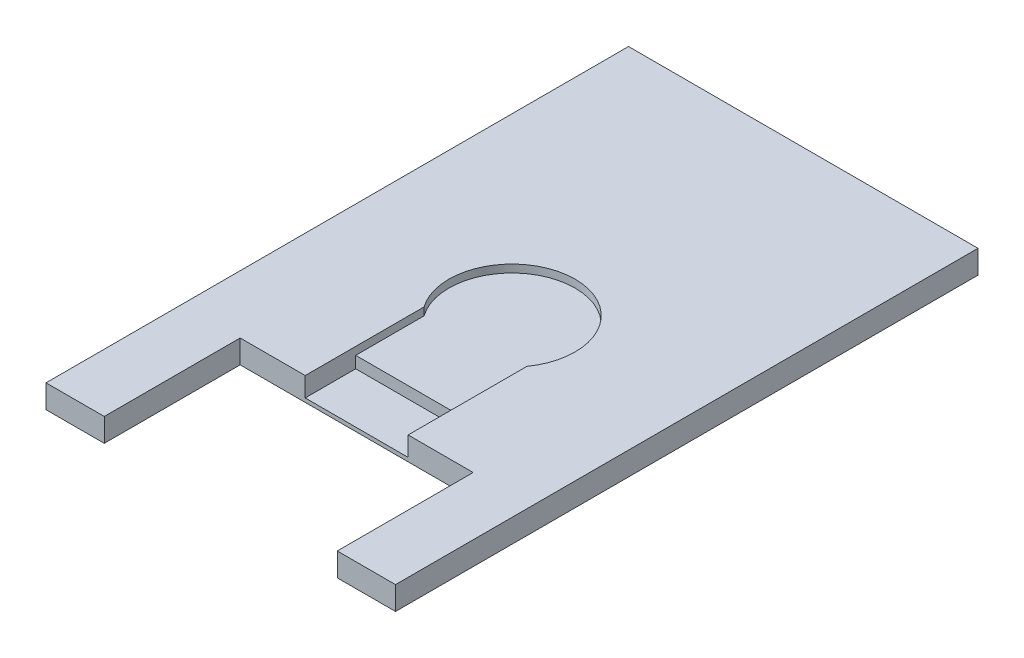
ISO-10303-21;
HEADER;
FILE_DESCRIPTION(('STEP AP214'),'2;1');
FILE_NAME('part.step','',(''),(''),'','','');
FILE_SCHEMA(('AUTOMOTIVE_DESIGN { 1 0 10303 214 1 1 1 1 }'));
ENDSEC;
DATA;
#1=APPLICATION_CONTEXT('core data for automotive mechanical design processes');
#2=APPLICATION_PROTOCOL_DEFINITION('international standard','automotive_design',2000,#1);
#3=PRODUCT_CONTEXT('',#1,'mechanical');
#4=PRODUCT('Part','Part','',(#3));
#5=PRODUCT_RELATED_PRODUCT_CATEGORY('part','',(#4));
#6=PRODUCT_DEFINITION_FORMATION('','',#4);
#7=PRODUCT_DEFINITION_CONTEXT('part definition',#1,'design');
#8=PRODUCT_DEFINITION('design','',#6,#7);
#9=PRODUCT_DEFINITION_SHAPE('','',#8);
#10=(LENGTH_UNIT() NAMED_UNIT(*) SI_UNIT(.MILLI.,.METRE.));
#11=(NAMED_UNIT(*) PLANE_ANGLE_UNIT() SI_UNIT($,.RADIAN.));
#12=(NAMED_UNIT(*) SI_UNIT($,.STERADIAN.) SOLID_ANGLE_UNIT());
#13=UNCERTAINTY_MEASURE_WITH_UNIT(LENGTH_MEASURE(1.E-05),#10,'distance_accuracy_value','');
#14=(GEOMETRIC_REPRESENTATION_CONTEXT(3) GLOBAL_UNCERTAINTY_ASSIGNED_CONTEXT((#13)) GLOBAL_UNIT_ASSIGNED_CONTEXT((#10,
#11,#12)) REPRESENTATION_CONTEXT('',''));
#15=CARTESIAN_POINT('',(0.,0.,0.));
#16=DIRECTION('',(0.,0.,1.));
#17=DIRECTION('',(1.,0.,0.));
#18=AXIS2_PLACEMENT_3D('',#15,#16,#17);
#19=CARTESIAN_POINT('',(-5.08735195444298,1.524,28.5140513925074));
#20=DIRECTION('',(0.,0.,-1.));
#21=DIRECTION('',(-1.,0.,0.));
#22=AXIS2_PLACEMENT_3D('',#19,#20,#21);
#23=PLANE('',#22);
#24=DIRECTION('',(0.,1.,0.));
#25=VECTOR('',#24,1.);
#26=CARTESIAN_POINT('',(13.962648045557,-2.032,28.5140513925057));
#27=LINE('',#26,#25);
#28=CARTESIAN_POINT('',(13.962648045557,0.,28.5140513925057));
#29=VERTEX_POINT('',#28);
#30=CARTESIAN_POINT('',(13.962648045557,1.524,28.5140513925057));
#31=VERTEX_POINT('',#30);
#32=EDGE_CURVE('E246',#29,#31,#27,.T.);
#33=ORIENTED_EDGE('',*,*,#32,.F.);
#34=DIRECTION('',(1.,0.,0.));
#35=VECTOR('',#34,1.);
#36=CARTESIAN_POINT('',(-5.08735195444298,0.,28.5140513925074));
#37=LINE('',#36,#35);
#38=CARTESIAN_POINT('',(17.772648045557,0.,28.5140513925074));
#39=VERTEX_POINT('',#38);
#40=EDGE_CURVE('E397',#29,#39,#37,.T.);
#41=ORIENTED_EDGE('',*,*,#40,.T.);
#42=DIRECTION('',(0.,-1.,0.));
#43=VECTOR('',#42,1.);
#44=CARTESIAN_POINT('',(17.772648045557,1.524,28.5140513925074));
#45=LINE('',#44,#43);
#46=CARTESIAN_POINT('',(17.772648045557,1.524,28.5140513925074));
#47=VERTEX_POINT('',#46);
#48=EDGE_CURVE('E414',#47,#39,#45,.T.);
#49=ORIENTED_EDGE('',*,*,#48,.F.);
#50=DIRECTION('',(1.,0.,0.));
#51=VECTOR('',#50,1.);
#52=CARTESIAN_POINT('',(-5.08735195444298,1.524,28.5140513925074));
#53=LINE('',#52,#51);
#54=EDGE_CURVE('E381',#31,#47,#53,.T.);
#55=ORIENTED_EDGE('',*,*,#54,.F.);
#56=EDGE_LOOP('',(#33,#41,#49,#55));
#57=FACE_BOUND('',#56,.T.);
#58=ADVANCED_FACE('F43',(#57),#23,.F.);
#59=CARTESIAN_POINT('',(-5.08735195444298,0.,28.5140513925074));
#60=VERTEX_POINT('',#59);
#61=CARTESIAN_POINT('',(-1.27735195444298,0.,28.5140513925057));
#62=VERTEX_POINT('',#61);
#63=EDGE_CURVE('E398',#60,#62,#37,.T.);
#64=ORIENTED_EDGE('',*,*,#63,.T.);
#65=DIRECTION('',(0.,1.,0.));
#66=VECTOR('',#65,1.);
#67=CARTESIAN_POINT('',(-1.27735195444298,-2.032,28.5140513925057));
#68=LINE('',#67,#66);
#69=CARTESIAN_POINT('',(-1.27735195444298,1.524,28.5140513925057));
#70=VERTEX_POINT('',#69);
#71=EDGE_CURVE('E255',#62,#70,#68,.T.);
#72=ORIENTED_EDGE('',*,*,#71,.T.);
#73=CARTESIAN_POINT('',(-5.08735195444298,1.524,28.5140513925074));
#74=VERTEX_POINT('',#73);
#75=EDGE_CURVE('E383',#74,#70,#53,.T.);
#76=ORIENTED_EDGE('',*,*,#75,.F.);
#77=DIRECTION('',(0.,-1.,0.));
#78=VECTOR('',#77,1.);
#79=CARTESIAN_POINT('',(-5.08735195444298,1.524,28.5140513925074));
#80=LINE('',#79,#78);
#81=EDGE_CURVE('E418',#74,#60,#80,.T.);
#82=ORIENTED_EDGE('',*,*,#81,.T.);
#83=EDGE_LOOP('',(#64,#72,#76,#82));
#84=FACE_BOUND('',#83,.T.);
#85=ADVANCED_FACE('F449',(#84),#23,.F.);
#86=CARTESIAN_POINT('',(0.,1.524,0.));
#87=DIRECTION('',(0.,1.,0.));
#88=DIRECTION('',(0.,0.,1.));
#89=AXIS2_PLACEMENT_3D('',#86,#87,#88);
#90=PLANE('',#89);
#91=DIRECTION('',(0.,0.,1.));
#92=VECTOR('',#91,1.);
#93=CARTESIAN_POINT('',(-1.27735195444298,1.524,0.));
#94=LINE('',#93,#92);
#95=CARTESIAN_POINT('',(-1.27735195444298,1.524,19.6240513925057));
#96=VERTEX_POINT('',#95);
#97=EDGE_CURVE('E234',#96,#70,#94,.T.);
#98=ORIENTED_EDGE('',*,*,#97,.F.);
#99=DIRECTION('',(-1.,0.,0.));
#100=VECTOR('',#99,1.);
#101=CARTESIAN_POINT('',(0.,1.524,19.6240513925057));
#102=LINE('',#101,#100);
#103=CARTESIAN_POINT('',(2.97714804554619,1.524,19.6240513925057));
#104=VERTEX_POINT('',#103);
#105=EDGE_CURVE('E239',#104,#96,#102,.T.);
#106=ORIENTED_EDGE('',*,*,#105,.F.);
#107=DIRECTION('',(0.,0.,1.));
#108=VECTOR('',#107,1.);
#109=CARTESIAN_POINT('',(2.97714804554618,1.524,0.));
#110=LINE('',#109,#108);
#111=CARTESIAN_POINT('',(2.97714804554618,1.524,11.8535421332451));
#112=VERTEX_POINT('',#111);
#113=EDGE_CURVE('E279',#112,#104,#110,.T.);
#114=ORIENTED_EDGE('',*,*,#113,.F.);
#115=CARTESIAN_POINT('',(6.34264804554618,1.524,9.46405139250738));
#116=DIRECTION('',(0.,1.,0.));
#117=DIRECTION('',(0.,0.,1.));
#118=AXIS2_PLACEMENT_3D('',#115,#116,#117);
#119=CIRCLE('',#118,4.12750000000079);
#120=CARTESIAN_POINT('',(9.70814804554619,1.524,11.8535421332451));
#121=VERTEX_POINT('',#120);
#122=EDGE_CURVE('E67',#121,#112,#119,.T.);
#123=ORIENTED_EDGE('',*,*,#122,.F.);
#124=DIRECTION('',(0.,0.,1.));
#125=VECTOR('',#124,1.);
#126=CARTESIAN_POINT('',(9.70814804554619,1.524,0.));
#127=LINE('',#126,#125);
#128=CARTESIAN_POINT('',(9.70814804554619,1.524,19.6240513925057));
#129=VERTEX_POINT('',#128);
#130=EDGE_CURVE('E269',#121,#129,#127,.T.);
#131=ORIENTED_EDGE('',*,*,#130,.T.);
#132=CARTESIAN_POINT('',(13.962648045557,1.524,19.6240513925057));
#133=VERTEX_POINT('',#132);
#134=EDGE_CURVE('E200',#133,#129,#102,.T.);
#135=ORIENTED_EDGE('',*,*,#134,.F.);
#136=DIRECTION('',(0.,0.,1.));
#137=VECTOR('',#136,1.);
#138=CARTESIAN_POINT('',(13.962648045557,1.524,0.));
#139=LINE('',#138,#137);
#140=EDGE_CURVE('E242',#133,#31,#139,.T.);
#141=ORIENTED_EDGE('',*,*,#140,.T.);
#142=ORIENTED_EDGE('',*,*,#54,.T.);
#143=DIRECTION('',(0.,0.,-1.));
#144=VECTOR('',#143,1.);
#145=CARTESIAN_POINT('',(17.772648045557,1.524,-9.58594860749262));
#146=LINE('',#145,#144);
#147=CARTESIAN_POINT('',(17.772648045557,1.524,-9.58594860749262));
#148=VERTEX_POINT('',#147);
#149=EDGE_CURVE('E387',#47,#148,#146,.T.);
#150=ORIENTED_EDGE('',*,*,#149,.T.);
#151=DIRECTION('',(-1.,0.,0.));
#152=VECTOR('',#151,1.);
#153=CARTESIAN_POINT('',(-5.08735195444298,1.524,-9.58594860749262));
#154=LINE('',#153,#152);
#155=CARTESIAN_POINT('',(-5.08735195444298,1.524,-9.58594860749262));
#156=VERTEX_POINT('',#155);
#157=EDGE_CURVE('E390',#148,#156,#154,.T.);
#158=ORIENTED_EDGE('',*,*,#157,.T.);
#159=DIRECTION('',(0.,0.,1.));
#160=VECTOR('',#159,1.);
#161=CARTESIAN_POINT('',(-5.08735195444298,1.524,-9.58594860749262));
#162=LINE('',#161,#160);
#163=EDGE_CURVE('E377',#156,#74,#162,.T.);
#164=ORIENTED_EDGE('',*,*,#163,.T.);
#165=ORIENTED_EDGE('',*,*,#75,.T.);
#166=EDGE_LOOP('',(#98,#106,#114,#123,#131,#135,#141,#142,#150,#158,#164,#165));
#167=FACE_BOUND('',#166,.T.);
#168=ADVANCED_FACE('F445',(#167),#90,.T.);
#169=CARTESIAN_POINT('',(0.,0.,0.));
#170=DIRECTION('',(0.,1.,0.));
#171=DIRECTION('',(0.,0.,1.));
#172=AXIS2_PLACEMENT_3D('',#169,#170,#171);
#173=PLANE('',#172);
#174=DIRECTION('',(-1.,0.,0.));
#175=VECTOR('',#174,1.);
#176=CARTESIAN_POINT('',(0.,0.,19.6240513925057));
#177=LINE('',#176,#175);
#178=CARTESIAN_POINT('',(13.962648045557,0.,19.6240513925057));
#179=VERTEX_POINT('',#178);
#180=CARTESIAN_POINT('',(-1.27735195444298,0.,19.6240513925057));
#181=VERTEX_POINT('',#180);
#182=EDGE_CURVE('E205',#179,#181,#177,.T.);
#183=ORIENTED_EDGE('',*,*,#182,.T.);
#184=DIRECTION('',(0.,0.,1.));
#185=VECTOR('',#184,1.);
#186=CARTESIAN_POINT('',(-1.27735195444298,0.,0.));
#187=LINE('',#186,#185);
#188=EDGE_CURVE('E11',#181,#62,#187,.T.);
#189=ORIENTED_EDGE('',*,*,#188,.T.);
#190=ORIENTED_EDGE('',*,*,#63,.F.);
#191=DIRECTION('',(0.,0.,1.));
#192=VECTOR('',#191,1.);
#193=CARTESIAN_POINT('',(-5.08735195444298,0.,-9.58594860749262));
#194=LINE('',#193,#192);
#195=CARTESIAN_POINT('',(-5.08735195444298,0.,-9.58594860749262));
#196=VERTEX_POINT('',#195);
#197=EDGE_CURVE('E376',#196,#60,#194,.T.);
#198=ORIENTED_EDGE('',*,*,#197,.F.);
#199=DIRECTION('',(-1.,0.,0.));
#200=VECTOR('',#199,1.);
#201=CARTESIAN_POINT('',(-5.08735195444298,0.,-9.58594860749262));
#202=LINE('',#201,#200);
#203=CARTESIAN_POINT('',(17.772648045557,0.,-9.58594860749262));
#204=VERTEX_POINT('',#203);
#205=EDGE_CURVE('E382',#204,#196,#202,.T.);
#206=ORIENTED_EDGE('',*,*,#205,.F.);
#207=DIRECTION('',(0.,0.,-1.));
#208=VECTOR('',#207,1.);
#209=CARTESIAN_POINT('',(17.772648045557,0.,-9.58594860749262));
#210=LINE('',#209,#208);
#211=EDGE_CURVE('E402',#39,#204,#210,.T.);
#212=ORIENTED_EDGE('',*,*,#211,.F.);
#213=ORIENTED_EDGE('',*,*,#40,.F.);
#214=DIRECTION('',(0.,0.,1.));
#215=VECTOR('',#214,1.);
#216=CARTESIAN_POINT('',(13.962648045557,0.,0.));
#217=LINE('',#216,#215);
#218=EDGE_CURVE('E52',#179,#29,#217,.T.);
#219=ORIENTED_EDGE('',*,*,#218,.F.);
#220=EDGE_LOOP('',(#183,#189,#190,#198,#206,#212,#213,#219));
#221=FACE_BOUND('',#220,.T.);
#222=DIRECTION('',(0.,0.,-1.));
#223=VECTOR('',#222,1.);
#224=CARTESIAN_POINT('',(-1.15035195442412,0.,16.9570513925048));
#225=LINE('',#224,#223);
#226=CARTESIAN_POINT('',(-1.15035195442412,0.,16.9570513925048));
#227=VERTEX_POINT('',#226);
#228=CARTESIAN_POINT('',(-1.15035195442411,0.,-6.91894860749518));
#229=VERTEX_POINT('',#228);
#230=EDGE_CURVE('E331',#227,#229,#225,.T.);
#231=ORIENTED_EDGE('',*,*,#230,.F.);
#232=DIRECTION('',(-1.,0.,0.));
#233=VECTOR('',#232,1.);
#234=CARTESIAN_POINT('',(-1.15035195442412,0.,16.9570513925048));
#235=LINE('',#234,#233);
#236=CARTESIAN_POINT('',(13.8356480455759,0.,16.9570513925048));
#237=VERTEX_POINT('',#236);
#238=EDGE_CURVE('E337',#237,#227,#235,.T.);
#239=ORIENTED_EDGE('',*,*,#238,.F.);
#240=DIRECTION('',(0.,0.,1.));
#241=VECTOR('',#240,1.);
#242=CARTESIAN_POINT('',(13.8356480455759,0.,16.9570513925048));
#243=LINE('',#242,#241);
#244=CARTESIAN_POINT('',(13.8356480455759,0.,-6.91894860749518));
#245=VERTEX_POINT('',#244);
#246=EDGE_CURVE('E354',#245,#237,#243,.T.);
#247=ORIENTED_EDGE('',*,*,#246,.F.);
#248=DIRECTION('',(1.,0.,0.));
#249=VECTOR('',#248,1.);
#250=CARTESIAN_POINT('',(-1.15035195442411,0.,-6.91894860749518));
#251=LINE('',#250,#249);
#252=EDGE_CURVE('E350',#229,#245,#251,.T.);
#253=ORIENTED_EDGE('',*,*,#252,.F.);
#254=EDGE_LOOP('',(#231,#239,#247,#253));
#255=FACE_BOUND('',#254,.T.);
#256=ADVANCED_FACE('F434',(#221,#255),#173,.F.);
#257=CARTESIAN_POINT('',(-5.08735195444298,1.524,-9.58594860749262));
#258=DIRECTION('',(1.,0.,0.));
#259=DIRECTION('',(0.,0.,-1.));
#260=AXIS2_PLACEMENT_3D('',#257,#258,#259);
#261=PLANE('',#260);
#262=ORIENTED_EDGE('',*,*,#197,.T.);
#263=ORIENTED_EDGE('',*,*,#81,.F.);
#264=ORIENTED_EDGE('',*,*,#163,.F.);
#265=DIRECTION('',(0.,-1.,0.));
#266=VECTOR('',#265,1.);
#267=CARTESIAN_POINT('',(-5.08735195444298,1.524,-9.58594860749262));
#268=LINE('',#267,#266);
#269=EDGE_CURVE('E393',#156,#196,#268,.T.);
#270=ORIENTED_EDGE('',*,*,#269,.T.);
#271=EDGE_LOOP('',(#262,#263,#264,#270));
#272=FACE_BOUND('',#271,.T.);
#273=ADVANCED_FACE('F45',(#272),#261,.F.);
#274=CARTESIAN_POINT('',(17.772648045557,1.524,-9.58594860749262));
#275=DIRECTION('',(-1.,0.,0.));
#276=DIRECTION('',(0.,0.,1.));
#277=AXIS2_PLACEMENT_3D('',#274,#275,#276);
#278=PLANE('',#277);
#279=ORIENTED_EDGE('',*,*,#211,.T.);
#280=DIRECTION('',(0.,-1.,0.));
#281=VECTOR('',#280,1.);
#282=CARTESIAN_POINT('',(17.772648045557,1.524,-9.58594860749262));
#283=LINE('',#282,#281);
#284=EDGE_CURVE('E410',#148,#204,#283,.T.);
#285=ORIENTED_EDGE('',*,*,#284,.F.);
#286=ORIENTED_EDGE('',*,*,#149,.F.);
#287=ORIENTED_EDGE('',*,*,#48,.T.);
#288=EDGE_LOOP('',(#279,#285,#286,#287));
#289=FACE_BOUND('',#288,.T.);
#290=ADVANCED_FACE('F476',(#289),#278,.F.);
#291=CARTESIAN_POINT('',(-5.08735195444298,1.524,-9.58594860749262));
#292=DIRECTION('',(0.,0.,1.));
#293=DIRECTION('',(1.,0.,0.));
#294=AXIS2_PLACEMENT_3D('',#291,#292,#293);
#295=PLANE('',#294);
#296=ORIENTED_EDGE('',*,*,#205,.T.);
#297=ORIENTED_EDGE('',*,*,#269,.F.);
#298=ORIENTED_EDGE('',*,*,#157,.F.);
#299=ORIENTED_EDGE('',*,*,#284,.T.);
#300=EDGE_LOOP('',(#296,#297,#298,#299));
#301=FACE_BOUND('',#300,.T.);
#302=ADVANCED_FACE('F479',(#301),#295,.F.);
#303=CARTESIAN_POINT('',(0.,-2.032,0.));
#304=DIRECTION('',(0.,-1.,0.));
#305=DIRECTION('',(0.,0.,-1.));
#306=AXIS2_PLACEMENT_3D('',#303,#304,#305);
#307=PLANE('',#306);
#308=DIRECTION('',(0.,0.,-1.));
#309=VECTOR('',#308,1.);
#310=CARTESIAN_POINT('',(-1.15035195442412,-2.032,16.9570513925048));
#311=LINE('',#310,#309);
#312=CARTESIAN_POINT('',(-1.15035195442412,-2.032,16.9570513925048));
#313=VERTEX_POINT('',#312);
#314=CARTESIAN_POINT('',(-1.15035195442411,-2.032,-6.91894860749518));
#315=VERTEX_POINT('',#314);
#316=EDGE_CURVE('E332',#313,#315,#311,.T.);
#317=ORIENTED_EDGE('',*,*,#316,.T.);
#318=DIRECTION('',(1.,0.,0.));
#319=VECTOR('',#318,1.);
#320=CARTESIAN_POINT('',(-1.15035195442411,-2.032,-6.91894860749518));
#321=LINE('',#320,#319);
#322=CARTESIAN_POINT('',(13.8356480455759,-2.032,-6.91894860749518));
#323=VERTEX_POINT('',#322);
#324=EDGE_CURVE('E336',#315,#323,#321,.T.);
#325=ORIENTED_EDGE('',*,*,#324,.T.);
#326=DIRECTION('',(0.,0.,1.));
#327=VECTOR('',#326,1.);
#328=CARTESIAN_POINT('',(13.8356480455759,-2.032,16.9570513925048));
#329=LINE('',#328,#327);
#330=CARTESIAN_POINT('',(13.8356480455759,-2.032,16.9570513925048));
#331=VERTEX_POINT('',#330);
#332=EDGE_CURVE('E340',#323,#331,#329,.T.);
#333=ORIENTED_EDGE('',*,*,#332,.T.);
#334=DIRECTION('',(-1.,0.,0.));
#335=VECTOR('',#334,1.);
#336=CARTESIAN_POINT('',(-1.15035195442412,-2.032,16.9570513925048));
#337=LINE('',#336,#335);
#338=EDGE_CURVE('E343',#331,#313,#337,.T.);
#339=ORIENTED_EDGE('',*,*,#338,.T.);
#340=EDGE_LOOP('',(#317,#325,#333,#339));
#341=FACE_BOUND('',#340,.T.);
#342=DIRECTION('',(1.,0.,0.));
#343=VECTOR('',#342,1.);
#344=CARTESIAN_POINT('',(-0.515351954424115,-2.032,-6.15694860749518));
#345=LINE('',#344,#343);
#346=CARTESIAN_POINT('',(-0.515351954424115,-2.032,-6.15694860749518));
#347=VERTEX_POINT('',#346);
#348=CARTESIAN_POINT('',(13.2006480455759,-2.032,-6.15694860749518));
#349=VERTEX_POINT('',#348);
#350=EDGE_CURVE('E293',#347,#349,#345,.T.);
#351=ORIENTED_EDGE('',*,*,#350,.F.);
#352=DIRECTION('',(0.,0.,-1.));
#353=VECTOR('',#352,1.);
#354=CARTESIAN_POINT('',(-0.515351954424117,-2.032,16.3220513925169));
#355=LINE('',#354,#353);
#356=CARTESIAN_POINT('',(-0.515351954424117,-2.032,16.3220513925169));
#357=VERTEX_POINT('',#356);
#358=EDGE_CURVE('E290',#357,#347,#355,.T.);
#359=ORIENTED_EDGE('',*,*,#358,.F.);
#360=DIRECTION('',(-1.,0.,0.));
#361=VECTOR('',#360,1.);
#362=CARTESIAN_POINT('',(-0.515351954424117,-2.032,16.3220513925169));
#363=LINE('',#362,#361);
#364=CARTESIAN_POINT('',(13.2006480455759,-2.032,16.3220513925169));
#365=VERTEX_POINT('',#364);
#366=EDGE_CURVE('E301',#365,#357,#363,.T.);
#367=ORIENTED_EDGE('',*,*,#366,.F.);
#368=DIRECTION('',(0.,0.,1.));
#369=VECTOR('',#368,1.);
#370=CARTESIAN_POINT('',(13.2006480455759,-2.032,16.3220513925169));
#371=LINE('',#370,#369);
#372=EDGE_CURVE('E297',#349,#365,#371,.T.);
#373=ORIENTED_EDGE('',*,*,#372,.F.);
#374=EDGE_LOOP('',(#351,#359,#367,#373));
#375=FACE_BOUND('',#374,.T.);
#376=ADVANCED_FACE('F483',(#341,#375),#307,.T.);
#377=CARTESIAN_POINT('',(-1.15035195442412,-2.032,16.9570513925048));
#378=DIRECTION('',(1.,0.,0.));
#379=DIRECTION('',(0.,0.,-1.));
#380=AXIS2_PLACEMENT_3D('',#377,#378,#379);
#381=PLANE('',#380);
#382=ORIENTED_EDGE('',*,*,#230,.T.);
#383=DIRECTION('',(0.,1.,0.));
#384=VECTOR('',#383,1.);
#385=CARTESIAN_POINT('',(-1.15035195442411,-2.032,-6.91894860749518));
#386=LINE('',#385,#384);
#387=EDGE_CURVE('E372',#315,#229,#386,.T.);
#388=ORIENTED_EDGE('',*,*,#387,.F.);
#389=ORIENTED_EDGE('',*,*,#316,.F.);
#390=DIRECTION('',(0.,1.,0.));
#391=VECTOR('',#390,1.);
#392=CARTESIAN_POINT('',(-1.15035195442412,-2.032,16.9570513925048));
#393=LINE('',#392,#391);
#394=EDGE_CURVE('E346',#313,#227,#393,.T.);
#395=ORIENTED_EDGE('',*,*,#394,.T.);
#396=EDGE_LOOP('',(#382,#388,#389,#395));
#397=FACE_BOUND('',#396,.T.);
#398=ADVANCED_FACE('F492',(#397),#381,.F.);
#399=CARTESIAN_POINT('',(-1.15035195442411,-2.032,-6.91894860749518));
#400=DIRECTION('',(0.,0.,1.));
#401=DIRECTION('',(1.,0.,0.));
#402=AXIS2_PLACEMENT_3D('',#399,#400,#401);
#403=PLANE('',#402);
#404=ORIENTED_EDGE('',*,*,#252,.T.);
#405=DIRECTION('',(0.,1.,0.));
#406=VECTOR('',#405,1.);
#407=CARTESIAN_POINT('',(13.8356480455759,-2.032,-6.91894860749518));
#408=LINE('',#407,#406);
#409=EDGE_CURVE('E368',#323,#245,#408,.T.);
#410=ORIENTED_EDGE('',*,*,#409,.F.);
#411=ORIENTED_EDGE('',*,*,#324,.F.);
#412=ORIENTED_EDGE('',*,*,#387,.T.);
#413=EDGE_LOOP('',(#404,#410,#411,#412));
#414=FACE_BOUND('',#413,.T.);
#415=ADVANCED_FACE('F495',(#414),#403,.F.);
#416=CARTESIAN_POINT('',(13.8356480455759,-2.032,16.9570513925048));
#417=DIRECTION('',(-1.,0.,0.));
#418=DIRECTION('',(0.,0.,1.));
#419=AXIS2_PLACEMENT_3D('',#416,#417,#418);
#420=PLANE('',#419);
#421=ORIENTED_EDGE('',*,*,#246,.T.);
#422=DIRECTION('',(0.,1.,0.));
#423=VECTOR('',#422,1.);
#424=CARTESIAN_POINT('',(13.8356480455759,-2.032,16.9570513925048));
#425=LINE('',#424,#423);
#426=EDGE_CURVE('E364',#331,#237,#425,.T.);
#427=ORIENTED_EDGE('',*,*,#426,.F.);
#428=ORIENTED_EDGE('',*,*,#332,.F.);
#429=ORIENTED_EDGE('',*,*,#409,.T.);
#430=EDGE_LOOP('',(#421,#427,#428,#429));
#431=FACE_BOUND('',#430,.T.);
#432=ADVANCED_FACE('F499',(#431),#420,.F.);
#433=CARTESIAN_POINT('',(-1.15035195442412,-2.032,16.9570513925048));
#434=DIRECTION('',(0.,0.,-1.));
#435=DIRECTION('',(-1.,0.,0.));
#436=AXIS2_PLACEMENT_3D('',#433,#434,#435);
#437=PLANE('',#436);
#438=ORIENTED_EDGE('',*,*,#238,.T.);
#439=ORIENTED_EDGE('',*,*,#394,.F.);
#440=ORIENTED_EDGE('',*,*,#338,.F.);
#441=ORIENTED_EDGE('',*,*,#426,.T.);
#442=EDGE_LOOP('',(#438,#439,#440,#441));
#443=FACE_BOUND('',#442,.T.);
#444=ADVANCED_FACE('F503',(#443),#437,.F.);
#445=CARTESIAN_POINT('',(-0.515351954424117,-2.032,16.3220513925169));
#446=DIRECTION('',(1.,0.,0.));
#447=DIRECTION('',(0.,0.,-1.));
#448=AXIS2_PLACEMENT_3D('',#445,#446,#447);
#449=PLANE('',#448);
#450=DIRECTION('',(0.,0.,-1.));
#451=VECTOR('',#450,1.);
#452=CARTESIAN_POINT('',(-0.515351954424117,0.,16.3220513925169));
#453=LINE('',#452,#451);
#454=CARTESIAN_POINT('',(-0.515351954424117,0.,16.3220513925169));
#455=VERTEX_POINT('',#454);
#456=CARTESIAN_POINT('',(-0.515351954424115,0.,-6.15694860749518));
#457=VERTEX_POINT('',#456);
#458=EDGE_CURVE('E287',#455,#457,#453,.T.);
#459=ORIENTED_EDGE('',*,*,#458,.F.);
#460=DIRECTION('',(0.,1.,0.));
#461=VECTOR('',#460,1.);
#462=CARTESIAN_POINT('',(-0.515351954424117,-2.032,16.3220513925169));
#463=LINE('',#462,#461);
#464=EDGE_CURVE('E304',#357,#455,#463,.T.);
#465=ORIENTED_EDGE('',*,*,#464,.F.);
#466=ORIENTED_EDGE('',*,*,#358,.T.);
#467=DIRECTION('',(0.,1.,0.));
#468=VECTOR('',#467,1.);
#469=CARTESIAN_POINT('',(-0.515351954424115,-2.032,-6.15694860749518));
#470=LINE('',#469,#468);
#471=EDGE_CURVE('E327',#347,#457,#470,.T.);
#472=ORIENTED_EDGE('',*,*,#471,.T.);
#473=EDGE_LOOP('',(#459,#465,#466,#472));
#474=FACE_BOUND('',#473,.T.);
#475=ADVANCED_FACE('F507',(#474),#449,.T.);
#476=CARTESIAN_POINT('',(-0.515351954424115,-2.032,-6.15694860749518));
#477=DIRECTION('',(0.,0.,1.));
#478=DIRECTION('',(1.,0.,0.));
#479=AXIS2_PLACEMENT_3D('',#476,#477,#478);
#480=PLANE('',#479);
#481=DIRECTION('',(1.,0.,0.));
#482=VECTOR('',#481,1.);
#483=CARTESIAN_POINT('',(-0.515351954424115,0.,-6.15694860749518));
#484=LINE('',#483,#482);
#485=CARTESIAN_POINT('',(13.2006480455759,0.,-6.15694860749518));
#486=VERTEX_POINT('',#485);
#487=EDGE_CURVE('E308',#457,#486,#484,.T.);
#488=ORIENTED_EDGE('',*,*,#487,.F.);
#489=ORIENTED_EDGE('',*,*,#471,.F.);
#490=ORIENTED_EDGE('',*,*,#350,.T.);
#491=DIRECTION('',(0.,1.,0.));
#492=VECTOR('',#491,1.);
#493=CARTESIAN_POINT('',(13.2006480455759,-2.032,-6.15694860749518));
#494=LINE('',#493,#492);
#495=EDGE_CURVE('E324',#349,#486,#494,.T.);
#496=ORIENTED_EDGE('',*,*,#495,.T.);
#497=EDGE_LOOP('',(#488,#489,#490,#496));
#498=FACE_BOUND('',#497,.T.);
#499=ADVANCED_FACE('F514',(#498),#480,.T.);
#500=CARTESIAN_POINT('',(13.2006480455759,-2.032,16.3220513925169));
#501=DIRECTION('',(-1.,0.,0.));
#502=DIRECTION('',(0.,0.,1.));
#503=AXIS2_PLACEMENT_3D('',#500,#501,#502);
#504=PLANE('',#503);
#505=DIRECTION('',(0.,0.,1.));
#506=VECTOR('',#505,1.);
#507=CARTESIAN_POINT('',(13.2006480455759,0.,16.3220513925169));
#508=LINE('',#507,#506);
#509=CARTESIAN_POINT('',(13.2006480455759,0.,16.3220513925169));
#510=VERTEX_POINT('',#509);
#511=EDGE_CURVE('E312',#486,#510,#508,.T.);
#512=ORIENTED_EDGE('',*,*,#511,.F.);
#513=ORIENTED_EDGE('',*,*,#495,.F.);
#514=ORIENTED_EDGE('',*,*,#372,.T.);
#515=DIRECTION('',(0.,1.,0.));
#516=VECTOR('',#515,1.);
#517=CARTESIAN_POINT('',(13.2006480455759,-2.032,16.3220513925169));
#518=LINE('',#517,#516);
#519=EDGE_CURVE('E321',#365,#510,#518,.T.);
#520=ORIENTED_EDGE('',*,*,#519,.T.);
#521=EDGE_LOOP('',(#512,#513,#514,#520));
#522=FACE_BOUND('',#521,.T.);
#523=ADVANCED_FACE('F518',(#522),#504,.T.);
#524=CARTESIAN_POINT('',(-0.515351954424117,-2.032,16.3220513925169));
#525=DIRECTION('',(0.,0.,-1.));
#526=DIRECTION('',(-1.,0.,0.));
#527=AXIS2_PLACEMENT_3D('',#524,#525,#526);
#528=PLANE('',#527);
#529=DIRECTION('',(-1.,0.,0.));
#530=VECTOR('',#529,1.);
#531=CARTESIAN_POINT('',(-0.515351954424117,0.,16.3220513925169));
#532=LINE('',#531,#530);
#533=EDGE_CURVE('E294',#510,#455,#532,.T.);
#534=ORIENTED_EDGE('',*,*,#533,.F.);
#535=ORIENTED_EDGE('',*,*,#519,.F.);
#536=ORIENTED_EDGE('',*,*,#366,.T.);
#537=ORIENTED_EDGE('',*,*,#464,.T.);
#538=EDGE_LOOP('',(#534,#535,#536,#537));
#539=FACE_BOUND('',#538,.T.);
#540=ADVANCED_FACE('F488',(#539),#528,.T.);
#541=ORIENTED_EDGE('',*,*,#533,.T.);
#542=ORIENTED_EDGE('',*,*,#458,.T.);
#543=ORIENTED_EDGE('',*,*,#487,.T.);
#544=ORIENTED_EDGE('',*,*,#511,.T.);
#545=EDGE_LOOP('',(#541,#542,#543,#544));
#546=FACE_BOUND('',#545,.T.);
#547=ADVANCED_FACE('F485',(#546),#173,.F.);
#548=CARTESIAN_POINT('',(6.34264804554618,1.016,9.46405139250738));
#549=DIRECTION('',(0.,1.,0.));
#550=DIRECTION('',(0.,0.,1.));
#551=AXIS2_PLACEMENT_3D('',#548,#549,#550);
#552=CYLINDRICAL_SURFACE('',#551,4.12750000000079);
#553=ORIENTED_EDGE('',*,*,#122,.T.);
#554=DIRECTION('',(0.,1.,0.));
#555=VECTOR('',#554,1.);
#556=CARTESIAN_POINT('',(2.97714804554618,1.016,11.8535421332451));
#557=LINE('',#556,#555);
#558=CARTESIAN_POINT('',(2.97714804554618,1.016,11.8535421332451));
#559=VERTEX_POINT('',#558);
#560=EDGE_CURVE('E276',#559,#112,#557,.T.);
#561=ORIENTED_EDGE('',*,*,#560,.F.);
#562=CARTESIAN_POINT('',(6.34264804554618,1.016,9.46405139250738));
#563=DIRECTION('',(0.,1.,0.));
#564=DIRECTION('',(0.,0.,1.));
#565=AXIS2_PLACEMENT_3D('',#562,#563,#564);
#566=CIRCLE('',#565,4.12750000000079);
#567=CARTESIAN_POINT('',(9.70814804554619,1.016,11.8535421332451));
#568=VERTEX_POINT('',#567);
#569=EDGE_CURVE('E264',#568,#559,#566,.T.);
#570=ORIENTED_EDGE('',*,*,#569,.F.);
#571=DIRECTION('',(0.,1.,0.));
#572=VECTOR('',#571,1.);
#573=CARTESIAN_POINT('',(9.70814804554619,1.016,11.8535421332451));
#574=LINE('',#573,#572);
#575=EDGE_CURVE('E284',#568,#121,#574,.T.);
#576=ORIENTED_EDGE('',*,*,#575,.T.);
#577=EDGE_LOOP('',(#553,#561,#570,#576));
#578=FACE_BOUND('',#577,.T.);
#579=ADVANCED_FACE('F457',(#578),#552,.F.);
#580=CARTESIAN_POINT('',(9.70814804554619,1.016,0.));
#581=DIRECTION('',(-1.,0.,0.));
#582=DIRECTION('',(0.,0.,1.));
#583=AXIS2_PLACEMENT_3D('',#580,#581,#582);
#584=PLANE('',#583);
#585=DIRECTION('',(0.,-1.,0.));
#586=VECTOR('',#585,1.);
#587=CARTESIAN_POINT('',(9.70814804554619,1.016,19.6240513925057));
#588=LINE('',#587,#586);
#589=CARTESIAN_POINT('',(9.70814804554619,0.254,19.6240513925057));
#590=VERTEX_POINT('',#589);
#591=EDGE_CURVE('E194',#129,#590,#588,.T.);
#592=ORIENTED_EDGE('',*,*,#591,.F.);
#593=ORIENTED_EDGE('',*,*,#130,.F.);
#594=ORIENTED_EDGE('',*,*,#575,.F.);
#595=DIRECTION('',(0.,0.,1.));
#596=VECTOR('',#595,1.);
#597=CARTESIAN_POINT('',(9.70814804554619,1.016,0.));
#598=LINE('',#597,#596);
#599=CARTESIAN_POINT('',(9.70814804554619,1.016,16.3220513925169));
#600=VERTEX_POINT('',#599);
#601=EDGE_CURVE('E273',#568,#600,#598,.T.);
#602=ORIENTED_EDGE('',*,*,#601,.T.);
#603=DIRECTION('',(0.,1.,0.));
#604=VECTOR('',#603,1.);
#605=CARTESIAN_POINT('',(9.70814804554619,0.254,16.3220513925169));
#606=LINE('',#605,#604);
#607=CARTESIAN_POINT('',(9.70814804554619,0.254,16.3220513925169));
#608=VERTEX_POINT('',#607);
#609=EDGE_CURVE('E211',#608,#600,#606,.T.);
#610=ORIENTED_EDGE('',*,*,#609,.F.);
#611=DIRECTION('',(0.,0.,-1.));
#612=VECTOR('',#611,1.);
#613=CARTESIAN_POINT('',(9.70814804554619,0.254,19.6240513925057));
#614=LINE('',#613,#612);
#615=EDGE_CURVE('E208',#590,#608,#614,.T.);
#616=ORIENTED_EDGE('',*,*,#615,.F.);
#617=EDGE_LOOP('',(#592,#593,#594,#602,#610,#616));
#618=FACE_BOUND('',#617,.T.);
#619=ADVANCED_FACE('F209',(#618),#584,.T.);
#620=CARTESIAN_POINT('',(2.97714804554618,1.016,0.));
#621=DIRECTION('',(-1.,0.,0.));
#622=DIRECTION('',(0.,0.,1.));
#623=AXIS2_PLACEMENT_3D('',#620,#621,#622);
#624=PLANE('',#623);
#625=ORIENTED_EDGE('',*,*,#113,.T.);
#626=DIRECTION('',(0.,-1.,0.));
#627=VECTOR('',#626,1.);
#628=CARTESIAN_POINT('',(2.97714804554619,1.016,19.6240513925057));
#629=LINE('',#628,#627);
#630=CARTESIAN_POINT('',(2.97714804554619,0.254,19.6240513925057));
#631=VERTEX_POINT('',#630);
#632=EDGE_CURVE('E59',#104,#631,#629,.T.);
#633=ORIENTED_EDGE('',*,*,#632,.T.);
#634=DIRECTION('',(0.,0.,1.));
#635=VECTOR('',#634,1.);
#636=CARTESIAN_POINT('',(2.97714804554619,0.254,19.6240513925057));
#637=LINE('',#636,#635);
#638=CARTESIAN_POINT('',(2.97714804554619,0.254,16.3220513925169));
#639=VERTEX_POINT('',#638);
#640=EDGE_CURVE('E219',#639,#631,#637,.T.);
#641=ORIENTED_EDGE('',*,*,#640,.F.);
#642=DIRECTION('',(0.,1.,0.));
#643=VECTOR('',#642,1.);
#644=CARTESIAN_POINT('',(2.97714804554619,0.254,16.3220513925169));
#645=LINE('',#644,#643);
#646=CARTESIAN_POINT('',(2.97714804554619,1.016,16.3220513925169));
#647=VERTEX_POINT('',#646);
#648=EDGE_CURVE('E231',#639,#647,#645,.T.);
#649=ORIENTED_EDGE('',*,*,#648,.T.);
#650=DIRECTION('',(0.,0.,1.));
#651=VECTOR('',#650,1.);
#652=CARTESIAN_POINT('',(2.97714804554618,1.016,0.));
#653=LINE('',#652,#651);
#654=EDGE_CURVE('E268',#559,#647,#653,.T.);
#655=ORIENTED_EDGE('',*,*,#654,.F.);
#656=ORIENTED_EDGE('',*,*,#560,.T.);
#657=EDGE_LOOP('',(#625,#633,#641,#649,#655,#656));
#658=FACE_BOUND('',#657,.T.);
#659=ADVANCED_FACE('F459',(#658),#624,.F.);
#660=CARTESIAN_POINT('',(0.,1.016,0.));
#661=DIRECTION('',(0.,1.,0.));
#662=DIRECTION('',(0.,0.,1.));
#663=AXIS2_PLACEMENT_3D('',#660,#661,#662);
#664=PLANE('',#663);
#665=DIRECTION('',(-1.,0.,0.));
#666=VECTOR('',#665,1.);
#667=CARTESIAN_POINT('',(2.97714804554619,1.016,16.3220513925169));
#668=LINE('',#667,#666);
#669=EDGE_CURVE('E223',#600,#647,#668,.T.);
#670=ORIENTED_EDGE('',*,*,#669,.F.);
#671=ORIENTED_EDGE('',*,*,#601,.F.);
#672=ORIENTED_EDGE('',*,*,#569,.T.);
#673=ORIENTED_EDGE('',*,*,#654,.T.);
#674=EDGE_LOOP('',(#670,#671,#672,#673));
#675=FACE_BOUND('',#674,.T.);
#676=ADVANCED_FACE('F456',(#675),#664,.T.);
#677=CARTESIAN_POINT('',(-1.27735195444298,-2.032,0.));
#678=DIRECTION('',(-1.,0.,0.));
#679=DIRECTION('',(0.,0.,1.));
#680=AXIS2_PLACEMENT_3D('',#677,#678,#679);
#681=PLANE('',#680);
#682=DIRECTION('',(0.,1.,0.));
#683=VECTOR('',#682,1.);
#684=CARTESIAN_POINT('',(-1.27735195444298,-2.032,19.6240513925057));
#685=LINE('',#684,#683);
#686=EDGE_CURVE('E252',#181,#96,#685,.T.);
#687=ORIENTED_EDGE('',*,*,#686,.T.);
#688=ORIENTED_EDGE('',*,*,#97,.T.);
#689=ORIENTED_EDGE('',*,*,#71,.F.);
#690=ORIENTED_EDGE('',*,*,#188,.F.);
#691=EDGE_LOOP('',(#687,#688,#689,#690));
#692=FACE_BOUND('',#691,.T.);
#693=ADVANCED_FACE('F447',(#692),#681,.F.);
#694=CARTESIAN_POINT('',(13.962648045557,-2.032,0.));
#695=DIRECTION('',(-1.,0.,0.));
#696=DIRECTION('',(0.,0.,1.));
#697=AXIS2_PLACEMENT_3D('',#694,#695,#696);
#698=PLANE('',#697);
#699=ORIENTED_EDGE('',*,*,#218,.T.);
#700=ORIENTED_EDGE('',*,*,#32,.T.);
#701=ORIENTED_EDGE('',*,*,#140,.F.);
#702=DIRECTION('',(0.,1.,0.));
#703=VECTOR('',#702,1.);
#704=CARTESIAN_POINT('',(13.962648045557,-2.032,19.6240513925057));
#705=LINE('',#704,#703);
#706=EDGE_CURVE('E249',#179,#133,#705,.T.);
#707=ORIENTED_EDGE('',*,*,#706,.F.);
#708=EDGE_LOOP('',(#699,#700,#701,#707));
#709=FACE_BOUND('',#708,.T.);
#710=ADVANCED_FACE('F426',(#709),#698,.T.);
#711=CARTESIAN_POINT('',(0.,-2.032,19.6240513925057));
#712=DIRECTION('',(0.,0.,-1.));
#713=DIRECTION('',(-1.,0.,0.));
#714=AXIS2_PLACEMENT_3D('',#711,#712,#713);
#715=PLANE('',#714);
#716=DIRECTION('',(1.,0.,0.));
#717=VECTOR('',#716,1.);
#718=CARTESIAN_POINT('',(2.97714804554619,0.254,19.6240513925057));
#719=LINE('',#718,#717);
#720=EDGE_CURVE('E198',#631,#590,#719,.T.);
#721=ORIENTED_EDGE('',*,*,#720,.F.);
#722=ORIENTED_EDGE('',*,*,#632,.F.);
#723=ORIENTED_EDGE('',*,*,#105,.T.);
#724=ORIENTED_EDGE('',*,*,#686,.F.);
#725=ORIENTED_EDGE('',*,*,#182,.F.);
#726=ORIENTED_EDGE('',*,*,#706,.T.);
#727=ORIENTED_EDGE('',*,*,#134,.T.);
#728=ORIENTED_EDGE('',*,*,#591,.T.);
#729=EDGE_LOOP('',(#721,#722,#723,#724,#725,#726,#727,#728));
#730=FACE_BOUND('',#729,.T.);
#731=ADVANCED_FACE('F196',(#730),#715,.F.);
#732=CARTESIAN_POINT('',(2.97714804554619,0.254,16.3220513925169));
#733=DIRECTION('',(0.,0.,-1.));
#734=DIRECTION('',(-1.,0.,0.));
#735=AXIS2_PLACEMENT_3D('',#732,#733,#734);
#736=PLANE('',#735);
#737=ORIENTED_EDGE('',*,*,#669,.T.);
#738=ORIENTED_EDGE('',*,*,#648,.F.);
#739=DIRECTION('',(-1.,0.,0.));
#740=VECTOR('',#739,1.);
#741=CARTESIAN_POINT('',(2.97714804554619,0.254,16.3220513925169));
#742=LINE('',#741,#740);
#743=EDGE_CURVE('E216',#608,#639,#742,.T.);
#744=ORIENTED_EDGE('',*,*,#743,.F.);
#745=ORIENTED_EDGE('',*,*,#609,.T.);
#746=EDGE_LOOP('',(#737,#738,#744,#745));
#747=FACE_BOUND('',#746,.T.);
#748=ADVANCED_FACE('F461',(#747),#736,.F.);
#749=CARTESIAN_POINT('',(0.,0.254,0.));
#750=DIRECTION('',(0.,-1.,0.));
#751=DIRECTION('',(0.,0.,-1.));
#752=AXIS2_PLACEMENT_3D('',#749,#750,#751);
#753=PLANE('',#752);
#754=ORIENTED_EDGE('',*,*,#640,.T.);
#755=ORIENTED_EDGE('',*,*,#720,.T.);
#756=ORIENTED_EDGE('',*,*,#615,.T.);
#757=ORIENTED_EDGE('',*,*,#743,.T.);
#758=EDGE_LOOP('',(#754,#755,#756,#757));
#759=FACE_BOUND('',#758,.T.);
#760=ADVANCED_FACE('F218',(#759),#753,.F.);
#761=CLOSED_SHELL('',(#58,#85,#168,#256,#273,#290,#302,#376,#398,#415,#432,#444,#475,#499,#523,
#540,#547,#579,#619,#659,#676,#693,#710,#731,#748,#760));
#762=MANIFOLD_SOLID_BREP('B2',#761);
#763=ADVANCED_BREP_SHAPE_REPRESENTATION('',(#18,#762),#14);
#764=SHAPE_DEFINITION_REPRESENTATION(#9,#763);
ENDSEC;
END-ISO-10303-21;
